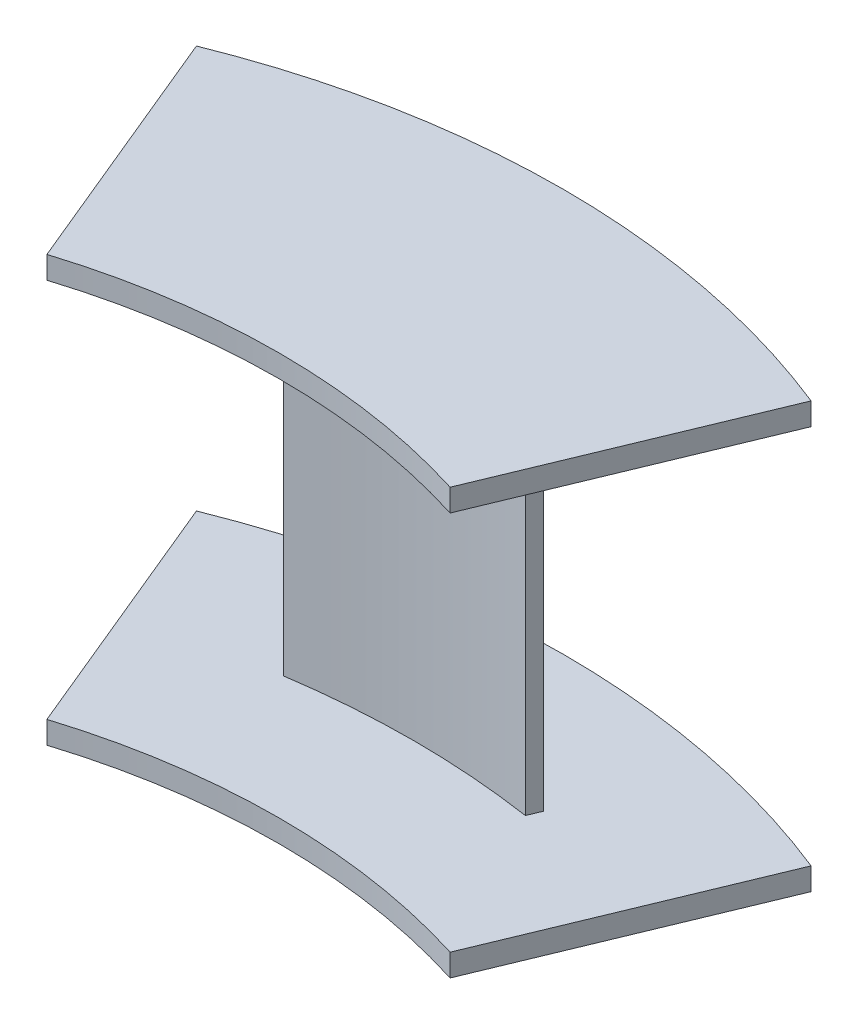
ISO-10303-21;
HEADER;
FILE_DESCRIPTION(('STEP AP214'),'2;1');
FILE_NAME('part.step','',(''),(''),'','','');
FILE_SCHEMA(('AUTOMOTIVE_DESIGN { 1 0 10303 214 1 1 1 1 }'));
ENDSEC;
DATA;
#1=APPLICATION_CONTEXT('core data for automotive mechanical design processes');
#2=APPLICATION_PROTOCOL_DEFINITION('international standard','automotive_design',2000,#1);
#3=PRODUCT_CONTEXT('',#1,'mechanical');
#4=PRODUCT('Part','Part','',(#3));
#5=PRODUCT_RELATED_PRODUCT_CATEGORY('part','',(#4));
#6=PRODUCT_DEFINITION_FORMATION('','',#4);
#7=PRODUCT_DEFINITION_CONTEXT('part definition',#1,'design');
#8=PRODUCT_DEFINITION('design','',#6,#7);
#9=PRODUCT_DEFINITION_SHAPE('','',#8);
#10=(LENGTH_UNIT() NAMED_UNIT(*) SI_UNIT(.MILLI.,.METRE.));
#11=(NAMED_UNIT(*) PLANE_ANGLE_UNIT() SI_UNIT($,.RADIAN.));
#12=(NAMED_UNIT(*) SI_UNIT($,.STERADIAN.) SOLID_ANGLE_UNIT());
#13=UNCERTAINTY_MEASURE_WITH_UNIT(LENGTH_MEASURE(1.E-05),#10,'distance_accuracy_value','');
#14=(GEOMETRIC_REPRESENTATION_CONTEXT(3) GLOBAL_UNCERTAINTY_ASSIGNED_CONTEXT((#13)) GLOBAL_UNIT_ASSIGNED_CONTEXT((#10,
#11,#12)) REPRESENTATION_CONTEXT('',''));
#15=CARTESIAN_POINT('',(0.,0.,0.));
#16=DIRECTION('',(0.,0.,1.));
#17=DIRECTION('',(1.,0.,0.));
#18=AXIS2_PLACEMENT_3D('',#15,#16,#17);
#19=CARTESIAN_POINT('',(-1.11007921332967,2.5,178.613322497837));
#20=DIRECTION('',(0.,-1.,0.));
#21=DIRECTION('',(0.,0.,-1.));
#22=AXIS2_PLACEMENT_3D('',#19,#20,#21);
#23=PLANE('',#22);
#24=CARTESIAN_POINT('',(-1.11007921332967,2.5,178.613322497837));
#25=DIRECTION('',(0.,-1.,0.));
#26=DIRECTION('',(0.,0.,-1.));
#27=AXIS2_PLACEMENT_3D('',#24,#25,#26);
#28=CIRCLE('',#27,151.);
#29=CARTESIAN_POINT('',(-46.1694901581836,2.5,34.4930620022959));
#30=VERTEX_POINT('',#29);
#31=CARTESIAN_POINT('',(43.9493317315242,2.5,34.4930620022959));
#32=VERTEX_POINT('',#31);
#33=EDGE_CURVE('E195',#30,#32,#28,.T.);
#34=ORIENTED_EDGE('',*,*,#33,.T.);
#35=DIRECTION('',(0.38268343236509,0.,-0.923879532511286));
#36=VECTOR('',#35,1.);
#37=CARTESIAN_POINT('',(43.9493317315242,2.5,34.4930620022959));
#38=LINE('',#37,#36);
#39=CARTESIAN_POINT('',(67.5801512233104,2.5,-22.5567829047645));
#40=VERTEX_POINT('',#39);
#41=EDGE_CURVE('E198',#32,#40,#38,.T.);
#42=ORIENTED_EDGE('',*,*,#41,.T.);
#43=CARTESIAN_POINT('',(-1.11007921332967,2.5,148.613322497837));
#44=DIRECTION('',(0.,1.,0.));
#45=DIRECTION('',(0.,0.,1.));
#46=AXIS2_PLACEMENT_3D('',#43,#44,#45);
#47=CIRCLE('',#46,184.438479556129);
#48=CARTESIAN_POINT('',(-69.8003096499697,2.5,-22.5567829047646));
#49=VERTEX_POINT('',#48);
#50=EDGE_CURVE('E201',#40,#49,#47,.T.);
#51=ORIENTED_EDGE('',*,*,#50,.T.);
#52=DIRECTION('',(0.38268343236509,0.,0.923879532511286));
#53=VECTOR('',#52,1.);
#54=CARTESIAN_POINT('',(-46.1694901581836,2.5,34.4930620022959));
#55=LINE('',#54,#53);
#56=EDGE_CURVE('E203',#49,#30,#55,.T.);
#57=ORIENTED_EDGE('',*,*,#56,.T.);
#58=EDGE_LOOP('',(#34,#42,#51,#57));
#59=FACE_BOUND('',#58,.T.);
#60=CARTESIAN_POINT('',(-1.11007921332967,2.5,178.613322497837));
#61=DIRECTION('',(0.,-1.,0.));
#62=DIRECTION('',(0.,0.,1.));
#63=AXIS2_PLACEMENT_3D('',#60,#61,#62);
#64=CIRCLE('',#63,181.);
#65=CARTESIAN_POINT('',(-28.1335067925173,2.5,-0.358000238159545));
#66=VERTEX_POINT('',#65);
#67=CARTESIAN_POINT('',(25.9133483658579,2.5,-0.358000238159545));
#68=VERTEX_POINT('',#67);
#69=EDGE_CURVE('E131',#66,#68,#64,.T.);
#70=ORIENTED_EDGE('',*,*,#69,.F.);
#71=DIRECTION('',(0.382683432365091,0.,0.923879532511287));
#72=VECTOR('',#71,1.);
#73=CARTESIAN_POINT('',(-29.3217010295623,2.5,-3.22655487996709));
#74=LINE('',#73,#72);
#75=CARTESIAN_POINT('',(-29.3217010295623,2.5,-3.22655487996712));
#76=VERTEX_POINT('',#75);
#77=EDGE_CURVE('E168',#76,#66,#74,.T.);
#78=ORIENTED_EDGE('',*,*,#77,.F.);
#79=CARTESIAN_POINT('',(-1.11007921332967,2.5,148.613322497837));
#80=DIRECTION('',(0.,1.,0.));
#81=DIRECTION('',(0.,0.,1.));
#82=AXIS2_PLACEMENT_3D('',#79,#80,#81);
#83=CIRCLE('',#82,154.438479556129);
#84=CARTESIAN_POINT('',(27.1015426029029,2.5,-3.22655487996709));
#85=VERTEX_POINT('',#84);
#86=EDGE_CURVE('E53',#85,#76,#83,.T.);
#87=ORIENTED_EDGE('',*,*,#86,.F.);
#88=DIRECTION('',(0.382683432365094,0.,-0.923879532511285));
#89=VECTOR('',#88,1.);
#90=CARTESIAN_POINT('',(25.9133483658579,2.5,-0.358000238159545));
#91=LINE('',#90,#89);
#92=EDGE_CURVE('E48',#68,#85,#91,.T.);
#93=ORIENTED_EDGE('',*,*,#92,.F.);
#94=EDGE_LOOP('',(#70,#78,#87,#93));
#95=FACE_BOUND('',#94,.T.);
#96=ADVANCED_FACE('F33',(#59,#95),#23,.F.);
#97=CARTESIAN_POINT('',(-1.11007921332967,2.5,178.613322497837));
#98=DIRECTION('',(0.,-1.,0.));
#99=DIRECTION('',(0.,0.,-1.));
#100=AXIS2_PLACEMENT_3D('',#97,#98,#99);
#101=CYLINDRICAL_SURFACE('',#100,151.);
#102=CARTESIAN_POINT('',(-1.11007921332967,-2.5,178.613322497837));
#103=DIRECTION('',(0.,-1.,0.));
#104=DIRECTION('',(0.,0.,-1.));
#105=AXIS2_PLACEMENT_3D('',#102,#103,#104);
#106=CIRCLE('',#105,151.);
#107=CARTESIAN_POINT('',(-46.1694901581836,-2.5,34.4930620022959));
#108=VERTEX_POINT('',#107);
#109=CARTESIAN_POINT('',(43.9493317315242,-2.5,34.4930620022959));
#110=VERTEX_POINT('',#109);
#111=EDGE_CURVE('E194',#108,#110,#106,.T.);
#112=ORIENTED_EDGE('',*,*,#111,.T.);
#113=DIRECTION('',(0.,-1.,0.));
#114=VECTOR('',#113,1.);
#115=CARTESIAN_POINT('',(43.9493317315242,2.5,34.4930620022959));
#116=LINE('',#115,#114);
#117=EDGE_CURVE('E11',#32,#110,#116,.T.);
#118=ORIENTED_EDGE('',*,*,#117,.F.);
#119=ORIENTED_EDGE('',*,*,#33,.F.);
#120=DIRECTION('',(0.,-1.,0.));
#121=VECTOR('',#120,1.);
#122=CARTESIAN_POINT('',(-46.1694901581836,2.5,34.4930620022959));
#123=LINE('',#122,#121);
#124=EDGE_CURVE('E205',#30,#108,#123,.T.);
#125=ORIENTED_EDGE('',*,*,#124,.T.);
#126=EDGE_LOOP('',(#112,#118,#119,#125));
#127=FACE_BOUND('',#126,.T.);
#128=ADVANCED_FACE('F35',(#127),#101,.F.);
#129=CARTESIAN_POINT('',(43.9493317315242,2.5,34.4930620022959));
#130=DIRECTION('',(-0.923879532511287,0.,-0.38268343236509));
#131=DIRECTION('',(-0.38268343236509,0.,0.923879532511287));
#132=AXIS2_PLACEMENT_3D('',#129,#130,#131);
#133=PLANE('',#132);
#134=DIRECTION('',(0.38268343236509,0.,-0.923879532511286));
#135=VECTOR('',#134,1.);
#136=CARTESIAN_POINT('',(43.9493317315242,-2.5,34.4930620022959));
#137=LINE('',#136,#135);
#138=CARTESIAN_POINT('',(67.5801512233104,-2.5,-22.5567829047645));
#139=VERTEX_POINT('',#138);
#140=EDGE_CURVE('E208',#110,#139,#137,.T.);
#141=ORIENTED_EDGE('',*,*,#140,.T.);
#142=DIRECTION('',(0.,-1.,0.));
#143=VECTOR('',#142,1.);
#144=CARTESIAN_POINT('',(67.5801512233104,2.5,-22.5567829047645));
#145=LINE('',#144,#143);
#146=EDGE_CURVE('E41',#40,#139,#145,.T.);
#147=ORIENTED_EDGE('',*,*,#146,.F.);
#148=ORIENTED_EDGE('',*,*,#41,.F.);
#149=ORIENTED_EDGE('',*,*,#117,.T.);
#150=EDGE_LOOP('',(#141,#147,#148,#149));
#151=FACE_BOUND('',#150,.T.);
#152=ADVANCED_FACE('F237',(#151),#133,.F.);
#153=CARTESIAN_POINT('',(-1.11007921332967,2.5,148.613322497837));
#154=DIRECTION('',(0.,-1.,0.));
#155=DIRECTION('',(0.,0.,-1.));
#156=AXIS2_PLACEMENT_3D('',#153,#154,#155);
#157=CYLINDRICAL_SURFACE('',#156,184.438479556129);
#158=CARTESIAN_POINT('',(-1.11007921332967,-2.5,148.613322497837));
#159=DIRECTION('',(0.,1.,0.));
#160=DIRECTION('',(0.,0.,1.));
#161=AXIS2_PLACEMENT_3D('',#158,#159,#160);
#162=CIRCLE('',#161,184.438479556129);
#163=CARTESIAN_POINT('',(-69.8003096499697,-2.5,-22.5567829047646));
#164=VERTEX_POINT('',#163);
#165=EDGE_CURVE('E210',#139,#164,#162,.T.);
#166=ORIENTED_EDGE('',*,*,#165,.T.);
#167=DIRECTION('',(0.,-1.,0.));
#168=VECTOR('',#167,1.);
#169=CARTESIAN_POINT('',(-69.8003096499697,2.5,-22.5567829047646));
#170=LINE('',#169,#168);
#171=EDGE_CURVE('E215',#49,#164,#170,.T.);
#172=ORIENTED_EDGE('',*,*,#171,.F.);
#173=ORIENTED_EDGE('',*,*,#50,.F.);
#174=ORIENTED_EDGE('',*,*,#146,.T.);
#175=EDGE_LOOP('',(#166,#172,#173,#174));
#176=FACE_BOUND('',#175,.T.);
#177=ADVANCED_FACE('F222',(#176),#157,.T.);
#178=CARTESIAN_POINT('',(-46.1694901581836,2.5,34.4930620022959));
#179=DIRECTION('',(0.923879532511287,0.,-0.38268343236509));
#180=DIRECTION('',(-0.38268343236509,0.,-0.923879532511287));
#181=AXIS2_PLACEMENT_3D('',#178,#179,#180);
#182=PLANE('',#181);
#183=DIRECTION('',(0.38268343236509,0.,0.923879532511286));
#184=VECTOR('',#183,1.);
#185=CARTESIAN_POINT('',(-46.1694901581836,-2.5,34.4930620022959));
#186=LINE('',#185,#184);
#187=EDGE_CURVE('E199',#164,#108,#186,.T.);
#188=ORIENTED_EDGE('',*,*,#187,.T.);
#189=ORIENTED_EDGE('',*,*,#124,.F.);
#190=ORIENTED_EDGE('',*,*,#56,.F.);
#191=ORIENTED_EDGE('',*,*,#171,.T.);
#192=EDGE_LOOP('',(#188,#189,#190,#191));
#193=FACE_BOUND('',#192,.T.);
#194=ADVANCED_FACE('F231',(#193),#182,.F.);
#195=CARTESIAN_POINT('',(-1.11007921332967,-2.5,178.613322497837));
#196=DIRECTION('',(0.,-1.,0.));
#197=DIRECTION('',(0.,0.,-1.));
#198=AXIS2_PLACEMENT_3D('',#195,#196,#197);
#199=PLANE('',#198);
#200=ORIENTED_EDGE('',*,*,#111,.F.);
#201=ORIENTED_EDGE('',*,*,#187,.F.);
#202=ORIENTED_EDGE('',*,*,#165,.F.);
#203=ORIENTED_EDGE('',*,*,#140,.F.);
#204=EDGE_LOOP('',(#200,#201,#202,#203));
#205=FACE_BOUND('',#204,.T.);
#206=ADVANCED_FACE('F228',(#205),#199,.T.);
#207=CARTESIAN_POINT('',(-1.11007921332967,87.5,178.613322497837));
#208=DIRECTION('',(0.,-1.,0.));
#209=DIRECTION('',(0.,0.,-1.));
#210=AXIS2_PLACEMENT_3D('',#207,#208,#209);
#211=CYLINDRICAL_SURFACE('',#210,181.);
#212=ORIENTED_EDGE('',*,*,#69,.T.);
#213=DIRECTION('',(0.,-1.,0.));
#214=VECTOR('',#213,1.);
#215=CARTESIAN_POINT('',(25.9133483658579,87.5,-0.358000238159545));
#216=LINE('',#215,#214);
#217=CARTESIAN_POINT('',(25.9133483658579,87.5,-0.358000238159545));
#218=VERTEX_POINT('',#217);
#219=EDGE_CURVE('E192',#218,#68,#216,.T.);
#220=ORIENTED_EDGE('',*,*,#219,.F.);
#221=CARTESIAN_POINT('',(-1.11007921332967,87.5,178.613322497837));
#222=DIRECTION('',(0.,-1.,0.));
#223=DIRECTION('',(0.,0.,1.));
#224=AXIS2_PLACEMENT_3D('',#221,#222,#223);
#225=CIRCLE('',#224,181.);
#226=CARTESIAN_POINT('',(-28.1335067925173,87.5,-0.358000238159545));
#227=VERTEX_POINT('',#226);
#228=EDGE_CURVE('E164',#227,#218,#225,.T.);
#229=ORIENTED_EDGE('',*,*,#228,.F.);
#230=DIRECTION('',(0.,-1.,0.));
#231=VECTOR('',#230,1.);
#232=CARTESIAN_POINT('',(-28.1335067925173,87.5,-0.358000238159545));
#233=LINE('',#232,#231);
#234=EDGE_CURVE('E177',#227,#66,#233,.T.);
#235=ORIENTED_EDGE('',*,*,#234,.T.);
#236=EDGE_LOOP('',(#212,#220,#229,#235));
#237=FACE_BOUND('',#236,.T.);
#238=ADVANCED_FACE('F250',(#237),#211,.F.);
#239=CARTESIAN_POINT('',(25.9133483658579,87.5,-0.358000238159545));
#240=DIRECTION('',(-0.923879532511285,0.,-0.382683432365094));
#241=DIRECTION('',(-0.382683432365094,0.,0.923879532511285));
#242=AXIS2_PLACEMENT_3D('',#239,#240,#241);
#243=PLANE('',#242);
#244=ORIENTED_EDGE('',*,*,#92,.T.);
#245=DIRECTION('',(0.,-1.,0.));
#246=VECTOR('',#245,1.);
#247=CARTESIAN_POINT('',(27.1015426029029,87.5,-3.22655487996709));
#248=LINE('',#247,#246);
#249=CARTESIAN_POINT('',(27.1015426029029,87.5,-3.22655487996709));
#250=VERTEX_POINT('',#249);
#251=EDGE_CURVE('E189',#250,#85,#248,.T.);
#252=ORIENTED_EDGE('',*,*,#251,.F.);
#253=DIRECTION('',(0.382683432365094,0.,-0.923879532511285));
#254=VECTOR('',#253,1.);
#255=CARTESIAN_POINT('',(25.9133483658579,87.5,-0.358000238159545));
#256=LINE('',#255,#254);
#257=EDGE_CURVE('E167',#218,#250,#256,.T.);
#258=ORIENTED_EDGE('',*,*,#257,.F.);
#259=ORIENTED_EDGE('',*,*,#219,.T.);
#260=EDGE_LOOP('',(#244,#252,#258,#259));
#261=FACE_BOUND('',#260,.T.);
#262=ADVANCED_FACE('F269',(#261),#243,.F.);
#263=CARTESIAN_POINT('',(-1.11007921332967,87.5,148.613322497837));
#264=DIRECTION('',(0.,-1.,0.));
#265=DIRECTION('',(0.,0.,-1.));
#266=AXIS2_PLACEMENT_3D('',#263,#264,#265);
#267=CYLINDRICAL_SURFACE('',#266,154.438479556129);
#268=ORIENTED_EDGE('',*,*,#86,.T.);
#269=DIRECTION('',(0.,-1.,0.));
#270=VECTOR('',#269,1.);
#271=CARTESIAN_POINT('',(-29.3217010295622,87.5,-3.22655487996712));
#272=LINE('',#271,#270);
#273=CARTESIAN_POINT('',(-29.3217010295622,87.5,-3.22655487996712));
#274=VERTEX_POINT('',#273);
#275=EDGE_CURVE('E186',#274,#76,#272,.T.);
#276=ORIENTED_EDGE('',*,*,#275,.F.);
#277=CARTESIAN_POINT('',(-1.11007921332967,87.5,148.613322497837));
#278=DIRECTION('',(0.,1.,0.));
#279=DIRECTION('',(0.,0.,1.));
#280=AXIS2_PLACEMENT_3D('',#277,#278,#279);
#281=CIRCLE('',#280,154.438479556129);
#282=EDGE_CURVE('E171',#250,#274,#281,.T.);
#283=ORIENTED_EDGE('',*,*,#282,.F.);
#284=ORIENTED_EDGE('',*,*,#251,.T.);
#285=EDGE_LOOP('',(#268,#276,#283,#284));
#286=FACE_BOUND('',#285,.T.);
#287=ADVANCED_FACE('F276',(#286),#267,.T.);
#288=CARTESIAN_POINT('',(-29.3217010295623,87.5,-3.22655487996709));
#289=DIRECTION('',(0.923879532511286,0.,-0.38268343236509));
#290=DIRECTION('',(-0.382683432365091,0.,-0.923879532511287));
#291=AXIS2_PLACEMENT_3D('',#288,#289,#290);
#292=PLANE('',#291);
#293=ORIENTED_EDGE('',*,*,#77,.T.);
#294=ORIENTED_EDGE('',*,*,#234,.F.);
#295=DIRECTION('',(0.382683432365091,0.,0.923879532511287));
#296=VECTOR('',#295,1.);
#297=CARTESIAN_POINT('',(-29.3217010295623,87.5,-3.22655487996709));
#298=LINE('',#297,#296);
#299=EDGE_CURVE('E174',#274,#227,#298,.T.);
#300=ORIENTED_EDGE('',*,*,#299,.F.);
#301=ORIENTED_EDGE('',*,*,#275,.T.);
#302=EDGE_LOOP('',(#293,#294,#300,#301));
#303=FACE_BOUND('',#302,.T.);
#304=ADVANCED_FACE('F283',(#303),#292,.F.);
#305=CARTESIAN_POINT('',(-1.11007921332967,87.5,178.613322497837));
#306=DIRECTION('',(0.,1.,0.));
#307=DIRECTION('',(0.,0.,-1.));
#308=AXIS2_PLACEMENT_3D('',#305,#306,#307);
#309=PLANE('',#308);
#310=CARTESIAN_POINT('',(-1.11007921332967,87.5,178.613322497837));
#311=DIRECTION('',(0.,-1.,0.));
#312=DIRECTION('',(0.,0.,-1.));
#313=AXIS2_PLACEMENT_3D('',#310,#311,#312);
#314=CIRCLE('',#313,151.);
#315=CARTESIAN_POINT('',(-46.1694901581836,87.5,34.4930620022959));
#316=VERTEX_POINT('',#315);
#317=CARTESIAN_POINT('',(43.9493317315242,87.5,34.4930620022959));
#318=VERTEX_POINT('',#317);
#319=EDGE_CURVE('E123',#316,#318,#314,.T.);
#320=ORIENTED_EDGE('',*,*,#319,.F.);
#321=DIRECTION('',(0.38268343236509,0.,0.923879532511286));
#322=VECTOR('',#321,1.);
#323=CARTESIAN_POINT('',(-46.1694901581836,87.5,34.4930620022959));
#324=LINE('',#323,#322);
#325=CARTESIAN_POINT('',(-69.8003096499697,87.5,-22.5567829047646));
#326=VERTEX_POINT('',#325);
#327=EDGE_CURVE('E139',#326,#316,#324,.T.);
#328=ORIENTED_EDGE('',*,*,#327,.F.);
#329=CARTESIAN_POINT('',(-1.11007921332967,87.5,148.613322497837));
#330=DIRECTION('',(0.,1.,0.));
#331=DIRECTION('',(0.,0.,1.));
#332=AXIS2_PLACEMENT_3D('',#329,#330,#331);
#333=CIRCLE('',#332,184.438479556129);
#334=CARTESIAN_POINT('',(67.5801512233104,87.5,-22.5567829047645));
#335=VERTEX_POINT('',#334);
#336=EDGE_CURVE('E146',#335,#326,#333,.T.);
#337=ORIENTED_EDGE('',*,*,#336,.F.);
#338=DIRECTION('',(0.38268343236509,0.,-0.923879532511286));
#339=VECTOR('',#338,1.);
#340=CARTESIAN_POINT('',(43.9493317315242,87.5,34.4930620022959));
#341=LINE('',#340,#339);
#342=EDGE_CURVE('E142',#318,#335,#341,.T.);
#343=ORIENTED_EDGE('',*,*,#342,.F.);
#344=EDGE_LOOP('',(#320,#328,#337,#343));
#345=FACE_BOUND('',#344,.T.);
#346=ORIENTED_EDGE('',*,*,#299,.T.);
#347=ORIENTED_EDGE('',*,*,#228,.T.);
#348=ORIENTED_EDGE('',*,*,#257,.T.);
#349=ORIENTED_EDGE('',*,*,#282,.T.);
#350=EDGE_LOOP('',(#346,#347,#348,#349));
#351=FACE_BOUND('',#350,.T.);
#352=ADVANCED_FACE('F136',(#345,#351),#309,.F.);
#353=CARTESIAN_POINT('',(-1.11007921332967,87.5,178.613322497837));
#354=DIRECTION('',(0.,1.,0.));
#355=DIRECTION('',(0.,0.,1.));
#356=AXIS2_PLACEMENT_3D('',#353,#354,#355);
#357=CYLINDRICAL_SURFACE('',#356,151.);
#358=CARTESIAN_POINT('',(-1.11007921332967,92.5,178.613322497837));
#359=DIRECTION('',(0.,-1.,0.));
#360=DIRECTION('',(0.,0.,-1.));
#361=AXIS2_PLACEMENT_3D('',#358,#359,#360);
#362=CIRCLE('',#361,151.);
#363=CARTESIAN_POINT('',(-46.1694901581836,92.5,34.4930620022959));
#364=VERTEX_POINT('',#363);
#365=CARTESIAN_POINT('',(43.9493317315242,92.5,34.4930620022959));
#366=VERTEX_POINT('',#365);
#367=EDGE_CURVE('E126',#364,#366,#362,.T.);
#368=ORIENTED_EDGE('',*,*,#367,.F.);
#369=DIRECTION('',(0.,1.,0.));
#370=VECTOR('',#369,1.);
#371=CARTESIAN_POINT('',(-46.1694901581836,87.5,34.4930620022959));
#372=LINE('',#371,#370);
#373=EDGE_CURVE('E120',#316,#364,#372,.T.);
#374=ORIENTED_EDGE('',*,*,#373,.F.);
#375=ORIENTED_EDGE('',*,*,#319,.T.);
#376=DIRECTION('',(0.,1.,0.));
#377=VECTOR('',#376,1.);
#378=CARTESIAN_POINT('',(43.9493317315242,87.5,34.4930620022959));
#379=LINE('',#378,#377);
#380=EDGE_CURVE('E151',#318,#366,#379,.T.);
#381=ORIENTED_EDGE('',*,*,#380,.T.);
#382=EDGE_LOOP('',(#368,#374,#375,#381));
#383=FACE_BOUND('',#382,.T.);
#384=ADVANCED_FACE('F122',(#383),#357,.F.);
#385=CARTESIAN_POINT('',(-46.1694901581836,87.5,34.4930620022959));
#386=DIRECTION('',(-0.923879532511287,0.,0.38268343236509));
#387=DIRECTION('',(0.38268343236509,0.,0.923879532511287));
#388=AXIS2_PLACEMENT_3D('',#385,#386,#387);
#389=PLANE('',#388);
#390=DIRECTION('',(0.38268343236509,0.,0.923879532511286));
#391=VECTOR('',#390,1.);
#392=CARTESIAN_POINT('',(-46.1694901581836,92.5,34.4930620022959));
#393=LINE('',#392,#391);
#394=CARTESIAN_POINT('',(-69.8003096499697,92.5,-22.5567829047646));
#395=VERTEX_POINT('',#394);
#396=EDGE_CURVE('E153',#395,#364,#393,.T.);
#397=ORIENTED_EDGE('',*,*,#396,.F.);
#398=DIRECTION('',(0.,1.,0.));
#399=VECTOR('',#398,1.);
#400=CARTESIAN_POINT('',(-69.8003096499697,87.5,-22.5567829047646));
#401=LINE('',#400,#399);
#402=EDGE_CURVE('E132',#326,#395,#401,.T.);
#403=ORIENTED_EDGE('',*,*,#402,.F.);
#404=ORIENTED_EDGE('',*,*,#327,.T.);
#405=ORIENTED_EDGE('',*,*,#373,.T.);
#406=EDGE_LOOP('',(#397,#403,#404,#405));
#407=FACE_BOUND('',#406,.T.);
#408=ADVANCED_FACE('F145',(#407),#389,.T.);
#409=CARTESIAN_POINT('',(-1.11007921332967,87.5,148.613322497837));
#410=DIRECTION('',(0.,1.,0.));
#411=DIRECTION('',(0.,0.,1.));
#412=AXIS2_PLACEMENT_3D('',#409,#410,#411);
#413=CYLINDRICAL_SURFACE('',#412,184.438479556129);
#414=CARTESIAN_POINT('',(-1.11007921332967,92.5,148.613322497837));
#415=DIRECTION('',(0.,1.,0.));
#416=DIRECTION('',(0.,0.,1.));
#417=AXIS2_PLACEMENT_3D('',#414,#415,#416);
#418=CIRCLE('',#417,184.438479556129);
#419=CARTESIAN_POINT('',(67.5801512233104,92.5,-22.5567829047645));
#420=VERTEX_POINT('',#419);
#421=EDGE_CURVE('E155',#420,#395,#418,.T.);
#422=ORIENTED_EDGE('',*,*,#421,.F.);
#423=DIRECTION('',(0.,1.,0.));
#424=VECTOR('',#423,1.);
#425=CARTESIAN_POINT('',(67.5801512233104,87.5,-22.5567829047645));
#426=LINE('',#425,#424);
#427=EDGE_CURVE('E161',#335,#420,#426,.T.);
#428=ORIENTED_EDGE('',*,*,#427,.F.);
#429=ORIENTED_EDGE('',*,*,#336,.T.);
#430=ORIENTED_EDGE('',*,*,#402,.T.);
#431=EDGE_LOOP('',(#422,#428,#429,#430));
#432=FACE_BOUND('',#431,.T.);
#433=ADVANCED_FACE('F310',(#432),#413,.T.);
#434=CARTESIAN_POINT('',(43.9493317315242,87.5,34.4930620022959));
#435=DIRECTION('',(0.923879532511287,0.,0.38268343236509));
#436=DIRECTION('',(0.38268343236509,0.,-0.923879532511287));
#437=AXIS2_PLACEMENT_3D('',#434,#435,#436);
#438=PLANE('',#437);
#439=DIRECTION('',(0.38268343236509,0.,-0.923879532511286));
#440=VECTOR('',#439,1.);
#441=CARTESIAN_POINT('',(43.9493317315242,92.5,34.4930620022959));
#442=LINE('',#441,#440);
#443=EDGE_CURVE('E143',#366,#420,#442,.T.);
#444=ORIENTED_EDGE('',*,*,#443,.F.);
#445=ORIENTED_EDGE('',*,*,#380,.F.);
#446=ORIENTED_EDGE('',*,*,#342,.T.);
#447=ORIENTED_EDGE('',*,*,#427,.T.);
#448=EDGE_LOOP('',(#444,#445,#446,#447));
#449=FACE_BOUND('',#448,.T.);
#450=ADVANCED_FACE('F317',(#449),#438,.T.);
#451=CARTESIAN_POINT('',(-1.11007921332967,92.5,178.613322497837));
#452=DIRECTION('',(0.,1.,0.));
#453=DIRECTION('',(0.,0.,-1.));
#454=AXIS2_PLACEMENT_3D('',#451,#452,#453);
#455=PLANE('',#454);
#456=ORIENTED_EDGE('',*,*,#367,.T.);
#457=ORIENTED_EDGE('',*,*,#443,.T.);
#458=ORIENTED_EDGE('',*,*,#421,.T.);
#459=ORIENTED_EDGE('',*,*,#396,.T.);
#460=EDGE_LOOP('',(#456,#457,#458,#459));
#461=FACE_BOUND('',#460,.T.);
#462=ADVANCED_FACE('F325',(#461),#455,.T.);
#463=CLOSED_SHELL('',(#96,#128,#152,#177,#194,#206,#238,#262,#287,#304,#352,#384,#408,#433,#450,#462));
#464=MANIFOLD_SOLID_BREP('B2',#463);
#465=ADVANCED_BREP_SHAPE_REPRESENTATION('',(#18,#464),#14);
#466=SHAPE_DEFINITION_REPRESENTATION(#9,#465);
ENDSEC;
END-ISO-10303-21;
